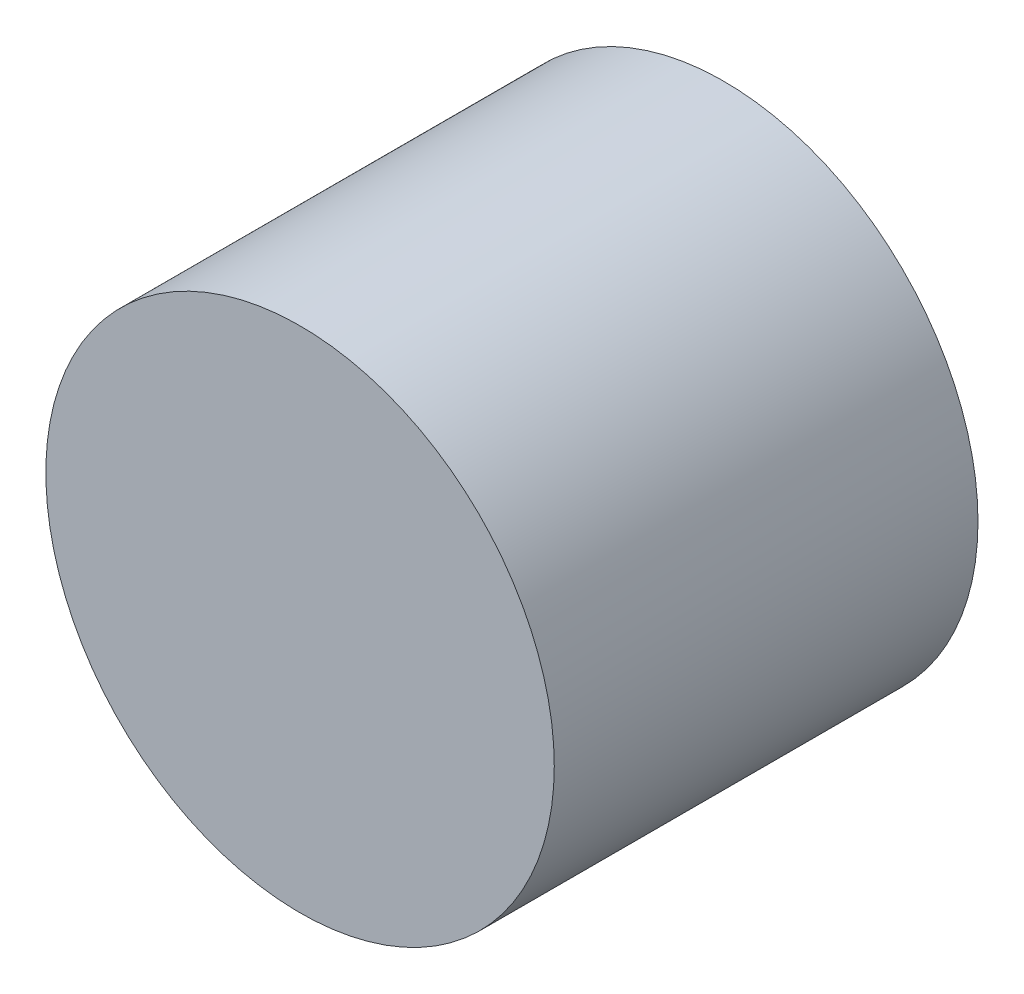
ISO-10303-21;
HEADER;
FILE_DESCRIPTION(('STEP AP214'),'2;1');
FILE_NAME('part.step','',(''),(''),'','','');
FILE_SCHEMA(('AUTOMOTIVE_DESIGN { 1 0 10303 214 1 1 1 1 }'));
ENDSEC;
DATA;
#1=APPLICATION_CONTEXT('core data for automotive mechanical design processes');
#2=APPLICATION_PROTOCOL_DEFINITION('international standard','automotive_design',2000,#1);
#3=PRODUCT_CONTEXT('',#1,'mechanical');
#4=PRODUCT('Part','Part','',(#3));
#5=PRODUCT_RELATED_PRODUCT_CATEGORY('part','',(#4));
#6=PRODUCT_DEFINITION_FORMATION('','',#4);
#7=PRODUCT_DEFINITION_CONTEXT('part definition',#1,'design');
#8=PRODUCT_DEFINITION('design','',#6,#7);
#9=PRODUCT_DEFINITION_SHAPE('','',#8);
#10=(LENGTH_UNIT() NAMED_UNIT(*) SI_UNIT(.MILLI.,.METRE.));
#11=(NAMED_UNIT(*) PLANE_ANGLE_UNIT() SI_UNIT($,.RADIAN.));
#12=(NAMED_UNIT(*) SI_UNIT($,.STERADIAN.) SOLID_ANGLE_UNIT());
#13=UNCERTAINTY_MEASURE_WITH_UNIT(LENGTH_MEASURE(1.E-05),#10,'distance_accuracy_value','');
#14=(GEOMETRIC_REPRESENTATION_CONTEXT(3) GLOBAL_UNCERTAINTY_ASSIGNED_CONTEXT((#13)) GLOBAL_UNIT_ASSIGNED_CONTEXT((#10,
#11,#12)) REPRESENTATION_CONTEXT('',''));
#15=CARTESIAN_POINT('',(0.,0.,0.));
#16=DIRECTION('',(0.,0.,1.));
#17=DIRECTION('',(1.,0.,0.));
#18=AXIS2_PLACEMENT_3D('',#15,#16,#17);
#19=CARTESIAN_POINT('',(0.,0.,40.));
#20=DIRECTION('',(0.,0.,-1.));
#21=DIRECTION('',(-1.,0.,0.));
#22=AXIS2_PLACEMENT_3D('',#19,#20,#21);
#23=CYLINDRICAL_SURFACE('',#22,24.);
#24=CARTESIAN_POINT('',(0.,0.,40.));
#25=DIRECTION('',(0.,0.,1.));
#26=DIRECTION('',(1.,0.,0.));
#27=AXIS2_PLACEMENT_3D('',#24,#25,#26);
#28=CIRCLE('',#27,24.);
#29=CARTESIAN_POINT('',(24.,0.,40.));
#30=VERTEX_POINT('',#29);
#31=EDGE_CURVE('E10',#30,#30,#28,.T.);
#32=ORIENTED_EDGE('',*,*,#31,.F.);
#33=EDGE_LOOP('',(#32));
#34=FACE_BOUND('',#33,.T.);
#35=CARTESIAN_POINT('',(0.,0.,0.));
#36=DIRECTION('',(0.,0.,1.));
#37=DIRECTION('',(1.,0.,0.));
#38=AXIS2_PLACEMENT_3D('',#35,#36,#37);
#39=CIRCLE('',#38,24.);
#40=CARTESIAN_POINT('',(24.,0.,0.));
#41=VERTEX_POINT('',#40);
#42=EDGE_CURVE('E40',#41,#41,#39,.T.);
#43=ORIENTED_EDGE('',*,*,#42,.T.);
#44=EDGE_LOOP('',(#43));
#45=FACE_BOUND('',#44,.T.);
#46=ADVANCED_FACE('F37',(#34,#45),#23,.T.);
#47=CARTESIAN_POINT('',(0.,0.,40.));
#48=DIRECTION('',(0.,0.,1.));
#49=DIRECTION('',(1.,0.,0.));
#50=AXIS2_PLACEMENT_3D('',#47,#48,#49);
#51=PLANE('',#50);
#52=ORIENTED_EDGE('',*,*,#31,.T.);
#53=EDGE_LOOP('',(#52));
#54=FACE_BOUND('',#53,.T.);
#55=ADVANCED_FACE('F54',(#54),#51,.T.);
#56=CARTESIAN_POINT('',(0.,0.,0.));
#57=DIRECTION('',(0.,0.,1.));
#58=DIRECTION('',(1.,0.,0.));
#59=AXIS2_PLACEMENT_3D('',#56,#57,#58);
#60=PLANE('',#59);
#61=ORIENTED_EDGE('',*,*,#42,.F.);
#62=EDGE_LOOP('',(#61));
#63=FACE_BOUND('',#62,.T.);
#64=ADVANCED_FACE('F52',(#63),#60,.F.);
#65=CLOSED_SHELL('',(#46,#55,#64));
#66=MANIFOLD_SOLID_BREP('B2',#65);
#67=ADVANCED_BREP_SHAPE_REPRESENTATION('',(#18,#66),#14);
#68=SHAPE_DEFINITION_REPRESENTATION(#9,#67);
ENDSEC;
END-ISO-10303-21;
